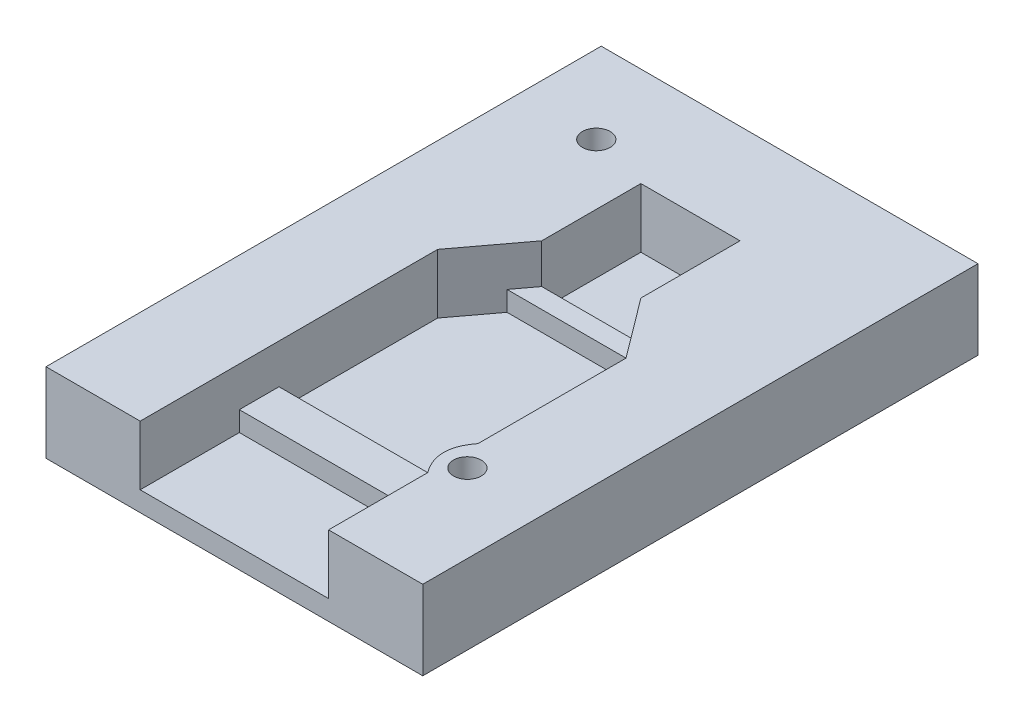
ISO-10303-21;
HEADER;
FILE_DESCRIPTION(('STEP AP214'),'2;1');
FILE_NAME('part.step','',(''),(''),'','','');
FILE_SCHEMA(('AUTOMOTIVE_DESIGN { 1 0 10303 214 1 1 1 1 }'));
ENDSEC;
DATA;
#1=APPLICATION_CONTEXT('core data for automotive mechanical design processes');
#2=APPLICATION_PROTOCOL_DEFINITION('international standard','automotive_design',2000,#1);
#3=PRODUCT_CONTEXT('',#1,'mechanical');
#4=PRODUCT('Part','Part','',(#3));
#5=PRODUCT_RELATED_PRODUCT_CATEGORY('part','',(#4));
#6=PRODUCT_DEFINITION_FORMATION('','',#4);
#7=PRODUCT_DEFINITION_CONTEXT('part definition',#1,'design');
#8=PRODUCT_DEFINITION('design','',#6,#7);
#9=PRODUCT_DEFINITION_SHAPE('','',#8);
#10=(LENGTH_UNIT() NAMED_UNIT(*) SI_UNIT(.MILLI.,.METRE.));
#11=(NAMED_UNIT(*) PLANE_ANGLE_UNIT() SI_UNIT($,.RADIAN.));
#12=(NAMED_UNIT(*) SI_UNIT($,.STERADIAN.) SOLID_ANGLE_UNIT());
#13=UNCERTAINTY_MEASURE_WITH_UNIT(LENGTH_MEASURE(1.E-05),#10,'distance_accuracy_value','');
#14=(GEOMETRIC_REPRESENTATION_CONTEXT(3) GLOBAL_UNCERTAINTY_ASSIGNED_CONTEXT((#13)) GLOBAL_UNIT_ASSIGNED_CONTEXT((#10,
#11,#12)) REPRESENTATION_CONTEXT('',''));
#15=CARTESIAN_POINT('',(0.,0.,0.));
#16=DIRECTION('',(0.,0.,1.));
#17=DIRECTION('',(1.,0.,0.));
#18=AXIS2_PLACEMENT_3D('',#15,#16,#17);
#19=CARTESIAN_POINT('',(0.,1.,0.));
#20=DIRECTION('',(0.,-1.,0.));
#21=DIRECTION('',(0.,0.,-1.));
#22=AXIS2_PLACEMENT_3D('',#19,#20,#21);
#23=PLANE('',#22);
#24=DIRECTION('',(-1.,0.,0.));
#25=VECTOR('',#24,1.);
#26=CARTESIAN_POINT('',(2.,1.,-2.));
#27=LINE('',#26,#25);
#28=CARTESIAN_POINT('',(11.1742122329964,1.,-2.00000000098245));
#29=VERTEX_POINT('',#28);
#30=CARTESIAN_POINT('',(2.,1.,-2.));
#31=VERTEX_POINT('',#30);
#32=EDGE_CURVE('E240',#29,#31,#27,.T.);
#33=ORIENTED_EDGE('',*,*,#32,.F.);
#34=CARTESIAN_POINT('',(11.5,1.,-2.53558572898459));
#35=CARTESIAN_POINT('',(10.5366275451212,1.,-1.30018745887848));
#36=CARTESIAN_POINT('',(11.5,1.,0.));
#37=B_SPLINE_CURVE_WITH_KNOTS('',2,(#34,#35,#36),.UNSPECIFIED.,.F.,.F.,(3,3),(0.,1.),.UNSPECIFIED.);
#38=CARTESIAN_POINT('',(11.5,1.,-2.53558572898459));
#39=VERTEX_POINT('',#38);
#40=EDGE_CURVE('E296',#39,#29,#37,.T.);
#41=ORIENTED_EDGE('',*,*,#40,.F.);
#42=DIRECTION('',(0.,0.,1.));
#43=VECTOR('',#42,1.);
#44=CARTESIAN_POINT('',(11.5,1.,-10.));
#45=LINE('',#44,#43);
#46=CARTESIAN_POINT('',(11.5,1.,-10.));
#47=VERTEX_POINT('',#46);
#48=EDGE_CURVE('E420',#47,#39,#45,.T.);
#49=ORIENTED_EDGE('',*,*,#48,.F.);
#50=DIRECTION('',(0.6,0.,0.8));
#51=VECTOR('',#50,1.);
#52=CARTESIAN_POINT('',(9.25000000000001,1.,-13.));
#53=LINE('',#52,#51);
#54=CARTESIAN_POINT('',(10.,1.,-12.));
#55=VERTEX_POINT('',#54);
#56=EDGE_CURVE('E456',#55,#47,#53,.T.);
#57=ORIENTED_EDGE('',*,*,#56,.F.);
#58=DIRECTION('',(1.,0.,0.));
#59=VECTOR('',#58,1.);
#60=CARTESIAN_POINT('',(10.,1.,-12.));
#61=LINE('',#60,#59);
#62=CARTESIAN_POINT('',(3.50000000000001,1.,-12.));
#63=VERTEX_POINT('',#62);
#64=EDGE_CURVE('E278',#63,#55,#61,.T.);
#65=ORIENTED_EDGE('',*,*,#64,.F.);
#66=DIRECTION('',(0.600000000000003,0.,-0.799999999999998));
#67=VECTOR('',#66,1.);
#68=CARTESIAN_POINT('',(4.25000000000001,1.,-13.));
#69=LINE('',#68,#67);
#70=CARTESIAN_POINT('',(2.,1.,-10.));
#71=VERTEX_POINT('',#70);
#72=EDGE_CURVE('E313',#71,#63,#69,.T.);
#73=ORIENTED_EDGE('',*,*,#72,.F.);
#74=DIRECTION('',(0.,0.,-1.));
#75=VECTOR('',#74,1.);
#76=CARTESIAN_POINT('',(2.,1.,-10.));
#77=LINE('',#76,#75);
#78=EDGE_CURVE('E292',#31,#71,#77,.T.);
#79=ORIENTED_EDGE('',*,*,#78,.F.);
#80=EDGE_LOOP('',(#33,#41,#49,#57,#65,#73,#79));
#81=FACE_BOUND('',#80,.T.);
#82=ADVANCED_FACE('F32',(#81),#23,.F.);
#83=CARTESIAN_POINT('',(2.,4.,-10.));
#84=DIRECTION('',(-1.,0.,0.));
#85=DIRECTION('',(0.,0.,1.));
#86=AXIS2_PLACEMENT_3D('',#83,#84,#85);
#87=PLANE('',#86);
#88=DIRECTION('',(0.,-1.,0.));
#89=VECTOR('',#88,1.);
#90=CARTESIAN_POINT('',(2.,2.,-2.));
#91=LINE('',#90,#89);
#92=CARTESIAN_POINT('',(2.,2.,-2.));
#93=VERTEX_POINT('',#92);
#94=EDGE_CURVE('E252',#93,#31,#91,.T.);
#95=ORIENTED_EDGE('',*,*,#94,.T.);
#96=ORIENTED_EDGE('',*,*,#78,.T.);
#97=DIRECTION('',(0.,-1.,0.));
#98=VECTOR('',#97,1.);
#99=CARTESIAN_POINT('',(2.,4.,-10.));
#100=LINE('',#99,#98);
#101=CARTESIAN_POINT('',(2.,4.,-10.));
#102=VERTEX_POINT('',#101);
#103=EDGE_CURVE('E384',#102,#71,#100,.T.);
#104=ORIENTED_EDGE('',*,*,#103,.F.);
#105=DIRECTION('',(0.,0.,-1.));
#106=VECTOR('',#105,1.);
#107=CARTESIAN_POINT('',(2.,4.,-2.));
#108=LINE('',#107,#106);
#109=CARTESIAN_POINT('',(2.,4.,5.));
#110=VERTEX_POINT('',#109);
#111=EDGE_CURVE('E293',#110,#102,#108,.T.);
#112=ORIENTED_EDGE('',*,*,#111,.F.);
#113=DIRECTION('',(0.,1.,0.));
#114=VECTOR('',#113,1.);
#115=CARTESIAN_POINT('',(2.,-32.8378486313773,5.));
#116=LINE('',#115,#114);
#117=CARTESIAN_POINT('',(2.,1.,5.));
#118=VERTEX_POINT('',#117);
#119=EDGE_CURVE('E182',#118,#110,#116,.T.);
#120=ORIENTED_EDGE('',*,*,#119,.F.);
#121=DIRECTION('',(0.,0.,1.));
#122=VECTOR('',#121,1.);
#123=CARTESIAN_POINT('',(2.,1.,0.));
#124=LINE('',#123,#122);
#125=CARTESIAN_POINT('',(2.,1.,0.));
#126=VERTEX_POINT('',#125);
#127=EDGE_CURVE('E49',#126,#118,#124,.T.);
#128=ORIENTED_EDGE('',*,*,#127,.F.);
#129=DIRECTION('',(0.,1.,0.));
#130=VECTOR('',#129,1.);
#131=CARTESIAN_POINT('',(2.,-32.8378486313773,0.));
#132=LINE('',#131,#130);
#133=CARTESIAN_POINT('',(2.,2.,0.));
#134=VERTEX_POINT('',#133);
#135=EDGE_CURVE('E214',#126,#134,#132,.T.);
#136=ORIENTED_EDGE('',*,*,#135,.T.);
#137=DIRECTION('',(0.,0.,1.));
#138=VECTOR('',#137,1.);
#139=CARTESIAN_POINT('',(2.,2.,0.));
#140=LINE('',#139,#138);
#141=EDGE_CURVE('E245',#93,#134,#140,.T.);
#142=ORIENTED_EDGE('',*,*,#141,.F.);
#143=EDGE_LOOP('',(#95,#96,#104,#112,#120,#128,#136,#142));
#144=FACE_BOUND('',#143,.T.);
#145=ADVANCED_FACE('F324',(#144),#87,.F.);
#146=CARTESIAN_POINT('',(11.5,4.,-2.53558572898459));
#147=CARTESIAN_POINT('',(10.5366275451212,4.,-1.30018745887848));
#148=CARTESIAN_POINT('',(11.5,4.,0.));
#149=B_SPLINE_CURVE_WITH_KNOTS('',2,(#146,#147,#148),.UNSPECIFIED.,.F.,.F.,(3,3),(0.,1.),.UNSPECIFIED.);
#150=DIRECTION('',(0.,-1.,0.));
#151=VECTOR('',#150,1.);
#152=SURFACE_OF_LINEAR_EXTRUSION('',#149,#151);
#153=DIRECTION('',(0.,-1.,0.));
#154=VECTOR('',#153,1.);
#155=CARTESIAN_POINT('',(11.1742122325654,4.,-2.));
#156=LINE('',#155,#154);
#157=CARTESIAN_POINT('',(11.1742122329961,2.,-2.));
#158=VERTEX_POINT('',#157);
#159=EDGE_CURVE('E11',#158,#29,#156,.T.);
#160=ORIENTED_EDGE('',*,*,#159,.F.);
#161=CARTESIAN_POINT('',(11.5,2.,-2.53558572898459));
#162=CARTESIAN_POINT('',(10.5366275451212,2.,-1.30018745887848));
#163=CARTESIAN_POINT('',(11.5,2.,0.));
#164=B_SPLINE_CURVE_WITH_KNOTS('',2,(#161,#162,#163),.UNSPECIFIED.,.F.,.F.,(3,3),(0.,1.),.UNSPECIFIED.);
#165=CARTESIAN_POINT('',(11.5,2.,0.));
#166=VERTEX_POINT('',#165);
#167=EDGE_CURVE('E41',#166,#158,#164,.F.);
#168=ORIENTED_EDGE('',*,*,#167,.F.);
#169=DIRECTION('',(0.,-1.,0.));
#170=VECTOR('',#169,1.);
#171=CARTESIAN_POINT('',(11.5,4.,0.));
#172=LINE('',#171,#170);
#173=CARTESIAN_POINT('',(11.5,4.,0.));
#174=VERTEX_POINT('',#173);
#175=EDGE_CURVE('E312',#174,#166,#172,.T.);
#176=ORIENTED_EDGE('',*,*,#175,.F.);
#177=CARTESIAN_POINT('',(11.5,4.,-2.53558572898459));
#178=VERTEX_POINT('',#177);
#179=EDGE_CURVE('E199',#178,#174,#149,.T.);
#180=ORIENTED_EDGE('',*,*,#179,.F.);
#181=DIRECTION('',(0.,-1.,0.));
#182=VECTOR('',#181,1.);
#183=CARTESIAN_POINT('',(11.5,4.,-2.53558572898459));
#184=LINE('',#183,#182);
#185=EDGE_CURVE('E418',#178,#39,#184,.T.);
#186=ORIENTED_EDGE('',*,*,#185,.T.);
#187=ORIENTED_EDGE('',*,*,#40,.T.);
#188=EDGE_LOOP('',(#160,#168,#176,#180,#186,#187));
#189=FACE_BOUND('',#188,.T.);
#190=ADVANCED_FACE('F319',(#189),#152,.F.);
#191=DIRECTION('',(-1.,0.,0.));
#192=VECTOR('',#191,1.);
#193=CARTESIAN_POINT('',(4.25000000000001,1.,-13.));
#194=LINE('',#193,#192);
#195=CARTESIAN_POINT('',(9.25000000000001,1.,-13.));
#196=VERTEX_POINT('',#195);
#197=CARTESIAN_POINT('',(4.25000000000001,1.,-13.));
#198=VERTEX_POINT('',#197);
#199=EDGE_CURVE('E268',#196,#198,#194,.T.);
#200=ORIENTED_EDGE('',*,*,#199,.F.);
#201=DIRECTION('',(0.,0.,1.));
#202=VECTOR('',#201,1.);
#203=CARTESIAN_POINT('',(9.25000000000001,1.,-18.));
#204=LINE('',#203,#202);
#205=CARTESIAN_POINT('',(9.25000000000001,1.,-18.));
#206=VERTEX_POINT('',#205);
#207=EDGE_CURVE('E458',#206,#196,#204,.T.);
#208=ORIENTED_EDGE('',*,*,#207,.F.);
#209=DIRECTION('',(1.,0.,0.));
#210=VECTOR('',#209,1.);
#211=CARTESIAN_POINT('',(4.25000000000001,1.,-18.));
#212=LINE('',#211,#210);
#213=CARTESIAN_POINT('',(4.25000000000001,1.,-18.));
#214=VERTEX_POINT('',#213);
#215=EDGE_CURVE('E404',#214,#206,#212,.T.);
#216=ORIENTED_EDGE('',*,*,#215,.F.);
#217=DIRECTION('',(0.,0.,-1.));
#218=VECTOR('',#217,1.);
#219=CARTESIAN_POINT('',(4.25000000000001,1.,-18.));
#220=LINE('',#219,#218);
#221=EDGE_CURVE('E460',#198,#214,#220,.T.);
#222=ORIENTED_EDGE('',*,*,#221,.F.);
#223=EDGE_LOOP('',(#200,#208,#216,#222));
#224=FACE_BOUND('',#223,.T.);
#225=ADVANCED_FACE('F323',(#224),#23,.F.);
#226=CARTESIAN_POINT('',(4.25000000000001,4.,-13.));
#227=DIRECTION('',(-0.799999999999998,0.,-0.600000000000003));
#228=DIRECTION('',(-0.600000000000003,0.,0.799999999999998));
#229=AXIS2_PLACEMENT_3D('',#226,#227,#228);
#230=PLANE('',#229);
#231=DIRECTION('',(0.,-1.,0.));
#232=VECTOR('',#231,1.);
#233=CARTESIAN_POINT('',(3.50000000000001,2.,-12.));
#234=LINE('',#233,#232);
#235=CARTESIAN_POINT('',(3.50000000000001,2.,-12.));
#236=VERTEX_POINT('',#235);
#237=EDGE_CURVE('E289',#236,#63,#234,.T.);
#238=ORIENTED_EDGE('',*,*,#237,.F.);
#239=DIRECTION('',(-0.600000000000003,0.,0.799999999999998));
#240=VECTOR('',#239,1.);
#241=CARTESIAN_POINT('',(3.50000000000001,2.,-12.));
#242=LINE('',#241,#240);
#243=CARTESIAN_POINT('',(4.25000000000001,2.,-13.));
#244=VERTEX_POINT('',#243);
#245=EDGE_CURVE('E264',#244,#236,#242,.T.);
#246=ORIENTED_EDGE('',*,*,#245,.F.);
#247=DIRECTION('',(0.,-1.,0.));
#248=VECTOR('',#247,1.);
#249=CARTESIAN_POINT('',(4.25000000000001,4.,-13.));
#250=LINE('',#249,#248);
#251=CARTESIAN_POINT('',(4.25000000000001,4.,-13.));
#252=VERTEX_POINT('',#251);
#253=EDGE_CURVE('E388',#252,#244,#250,.T.);
#254=ORIENTED_EDGE('',*,*,#253,.F.);
#255=DIRECTION('',(0.600000000000003,0.,-0.799999999999998));
#256=VECTOR('',#255,1.);
#257=CARTESIAN_POINT('',(4.25000000000001,4.,-13.));
#258=LINE('',#257,#256);
#259=EDGE_CURVE('E295',#102,#252,#258,.T.);
#260=ORIENTED_EDGE('',*,*,#259,.F.);
#261=ORIENTED_EDGE('',*,*,#103,.T.);
#262=ORIENTED_EDGE('',*,*,#72,.T.);
#263=EDGE_LOOP('',(#238,#246,#254,#260,#261,#262));
#264=FACE_BOUND('',#263,.T.);
#265=ADVANCED_FACE('F335',(#264),#230,.F.);
#266=CARTESIAN_POINT('',(9.25000000000001,4.,-13.));
#267=DIRECTION('',(0.8,0.,-0.6));
#268=DIRECTION('',(-0.6,0.,-0.8));
#269=AXIS2_PLACEMENT_3D('',#266,#267,#268);
#270=PLANE('',#269);
#271=DIRECTION('',(0.,-1.,0.));
#272=VECTOR('',#271,1.);
#273=CARTESIAN_POINT('',(10.,2.,-12.));
#274=LINE('',#273,#272);
#275=CARTESIAN_POINT('',(10.,2.,-12.));
#276=VERTEX_POINT('',#275);
#277=EDGE_CURVE('E287',#276,#55,#274,.T.);
#278=ORIENTED_EDGE('',*,*,#277,.T.);
#279=ORIENTED_EDGE('',*,*,#56,.T.);
#280=DIRECTION('',(0.,-1.,0.));
#281=VECTOR('',#280,1.);
#282=CARTESIAN_POINT('',(11.5,4.,-10.));
#283=LINE('',#282,#281);
#284=CARTESIAN_POINT('',(11.5,4.,-10.));
#285=VERTEX_POINT('',#284);
#286=EDGE_CURVE('E410',#285,#47,#283,.T.);
#287=ORIENTED_EDGE('',*,*,#286,.F.);
#288=DIRECTION('',(0.6,0.,0.8));
#289=VECTOR('',#288,1.);
#290=CARTESIAN_POINT('',(9.25000000000001,4.,-13.));
#291=LINE('',#290,#289);
#292=CARTESIAN_POINT('',(9.25000000000001,4.,-13.));
#293=VERTEX_POINT('',#292);
#294=EDGE_CURVE('E304',#293,#285,#291,.T.);
#295=ORIENTED_EDGE('',*,*,#294,.F.);
#296=DIRECTION('',(0.,-1.,0.));
#297=VECTOR('',#296,1.);
#298=CARTESIAN_POINT('',(9.25000000000001,4.,-13.));
#299=LINE('',#298,#297);
#300=CARTESIAN_POINT('',(9.25000000000001,2.,-13.));
#301=VERTEX_POINT('',#300);
#302=EDGE_CURVE('E406',#293,#301,#299,.T.);
#303=ORIENTED_EDGE('',*,*,#302,.T.);
#304=DIRECTION('',(-0.6,0.,-0.8));
#305=VECTOR('',#304,1.);
#306=CARTESIAN_POINT('',(9.25000000000001,2.,-13.));
#307=LINE('',#306,#305);
#308=EDGE_CURVE('E271',#276,#301,#307,.T.);
#309=ORIENTED_EDGE('',*,*,#308,.F.);
#310=EDGE_LOOP('',(#278,#279,#287,#295,#303,#309));
#311=FACE_BOUND('',#310,.T.);
#312=ADVANCED_FACE('F332',(#311),#270,.F.);
#313=CARTESIAN_POINT('',(0.,1.,0.));
#314=DIRECTION('',(0.,0.,-1.));
#315=DIRECTION('',(-1.,0.,0.));
#316=AXIS2_PLACEMENT_3D('',#313,#314,#315);
#317=PLANE('',#316);
#318=DIRECTION('',(1.,0.,0.));
#319=VECTOR('',#318,1.);
#320=CARTESIAN_POINT('',(2.,2.,0.));
#321=LINE('',#320,#319);
#322=EDGE_CURVE('E248',#134,#166,#321,.T.);
#323=ORIENTED_EDGE('',*,*,#322,.F.);
#324=ORIENTED_EDGE('',*,*,#135,.F.);
#325=DIRECTION('',(1.,0.,0.));
#326=VECTOR('',#325,1.);
#327=CARTESIAN_POINT('',(0.,1.,0.));
#328=LINE('',#327,#326);
#329=CARTESIAN_POINT('',(11.5,1.,0.));
#330=VERTEX_POINT('',#329);
#331=EDGE_CURVE('E222',#126,#330,#328,.T.);
#332=ORIENTED_EDGE('',*,*,#331,.T.);
#333=DIRECTION('',(0.,1.,0.));
#334=VECTOR('',#333,1.);
#335=CARTESIAN_POINT('',(11.5,-32.8378486313773,0.));
#336=LINE('',#335,#334);
#337=EDGE_CURVE('E183',#330,#166,#336,.T.);
#338=ORIENTED_EDGE('',*,*,#337,.T.);
#339=EDGE_LOOP('',(#323,#324,#332,#338));
#340=FACE_BOUND('',#339,.T.);
#341=ADVANCED_FACE('F34',(#340),#317,.F.);
#342=CARTESIAN_POINT('',(4.25000000000001,4.,-18.));
#343=DIRECTION('',(-1.,0.,0.));
#344=DIRECTION('',(0.,0.,1.));
#345=AXIS2_PLACEMENT_3D('',#342,#343,#344);
#346=PLANE('',#345);
#347=ORIENTED_EDGE('',*,*,#221,.T.);
#348=DIRECTION('',(0.,-1.,0.));
#349=VECTOR('',#348,1.);
#350=CARTESIAN_POINT('',(4.25000000000001,4.,-18.));
#351=LINE('',#350,#349);
#352=CARTESIAN_POINT('',(4.25000000000001,4.,-18.));
#353=VERTEX_POINT('',#352);
#354=EDGE_CURVE('E392',#353,#214,#351,.T.);
#355=ORIENTED_EDGE('',*,*,#354,.F.);
#356=DIRECTION('',(0.,0.,-1.));
#357=VECTOR('',#356,1.);
#358=CARTESIAN_POINT('',(4.25000000000001,4.,-18.));
#359=LINE('',#358,#357);
#360=EDGE_CURVE('E298',#252,#353,#359,.T.);
#361=ORIENTED_EDGE('',*,*,#360,.F.);
#362=ORIENTED_EDGE('',*,*,#253,.T.);
#363=DIRECTION('',(0.,-1.,0.));
#364=VECTOR('',#363,1.);
#365=CARTESIAN_POINT('',(4.25000000000001,2.,-13.));
#366=LINE('',#365,#364);
#367=EDGE_CURVE('E277',#244,#198,#366,.T.);
#368=ORIENTED_EDGE('',*,*,#367,.T.);
#369=EDGE_LOOP('',(#347,#355,#361,#362,#368));
#370=FACE_BOUND('',#369,.T.);
#371=ADVANCED_FACE('F343',(#370),#346,.F.);
#372=CARTESIAN_POINT('',(4.25000000000001,4.,-18.));
#373=DIRECTION('',(0.,0.,-1.));
#374=DIRECTION('',(-1.,0.,0.));
#375=AXIS2_PLACEMENT_3D('',#372,#373,#374);
#376=PLANE('',#375);
#377=ORIENTED_EDGE('',*,*,#215,.T.);
#378=DIRECTION('',(0.,-1.,0.));
#379=VECTOR('',#378,1.);
#380=CARTESIAN_POINT('',(9.25000000000001,4.,-18.));
#381=LINE('',#380,#379);
#382=CARTESIAN_POINT('',(9.25000000000001,4.,-18.));
#383=VERTEX_POINT('',#382);
#384=EDGE_CURVE('E403',#383,#206,#381,.T.);
#385=ORIENTED_EDGE('',*,*,#384,.F.);
#386=DIRECTION('',(1.,0.,0.));
#387=VECTOR('',#386,1.);
#388=CARTESIAN_POINT('',(4.25000000000001,4.,-18.));
#389=LINE('',#388,#387);
#390=EDGE_CURVE('E300',#353,#383,#389,.T.);
#391=ORIENTED_EDGE('',*,*,#390,.F.);
#392=ORIENTED_EDGE('',*,*,#354,.T.);
#393=EDGE_LOOP('',(#377,#385,#391,#392));
#394=FACE_BOUND('',#393,.T.);
#395=ADVANCED_FACE('F339',(#394),#376,.F.);
#396=CARTESIAN_POINT('',(9.25000000000001,4.,-18.));
#397=DIRECTION('',(1.,0.,0.));
#398=DIRECTION('',(0.,0.,-1.));
#399=AXIS2_PLACEMENT_3D('',#396,#397,#398);
#400=PLANE('',#399);
#401=ORIENTED_EDGE('',*,*,#207,.T.);
#402=DIRECTION('',(0.,-1.,0.));
#403=VECTOR('',#402,1.);
#404=CARTESIAN_POINT('',(9.25000000000001,2.,-13.));
#405=LINE('',#404,#403);
#406=EDGE_CURVE('E284',#301,#196,#405,.T.);
#407=ORIENTED_EDGE('',*,*,#406,.F.);
#408=ORIENTED_EDGE('',*,*,#302,.F.);
#409=DIRECTION('',(0.,0.,1.));
#410=VECTOR('',#409,1.);
#411=CARTESIAN_POINT('',(9.25000000000001,4.,-18.));
#412=LINE('',#411,#410);
#413=EDGE_CURVE('E302',#383,#293,#412,.T.);
#414=ORIENTED_EDGE('',*,*,#413,.F.);
#415=ORIENTED_EDGE('',*,*,#384,.T.);
#416=EDGE_LOOP('',(#401,#407,#408,#414,#415));
#417=FACE_BOUND('',#416,.T.);
#418=ADVANCED_FACE('F330',(#417),#400,.F.);
#419=CARTESIAN_POINT('',(11.5,4.,-10.));
#420=DIRECTION('',(1.,0.,0.));
#421=DIRECTION('',(0.,0.,-1.));
#422=AXIS2_PLACEMENT_3D('',#419,#420,#421);
#423=PLANE('',#422);
#424=ORIENTED_EDGE('',*,*,#48,.T.);
#425=ORIENTED_EDGE('',*,*,#185,.F.);
#426=DIRECTION('',(0.,0.,1.));
#427=VECTOR('',#426,1.);
#428=CARTESIAN_POINT('',(11.5,4.,-10.));
#429=LINE('',#428,#427);
#430=EDGE_CURVE('E306',#285,#178,#429,.T.);
#431=ORIENTED_EDGE('',*,*,#430,.F.);
#432=ORIENTED_EDGE('',*,*,#286,.T.);
#433=EDGE_LOOP('',(#424,#425,#431,#432));
#434=FACE_BOUND('',#433,.T.);
#435=ADVANCED_FACE('F327',(#434),#423,.F.);
#436=CARTESIAN_POINT('',(11.0183137725606,4.,-1.28399016168539));
#437=DIRECTION('',(0.,-1.,0.));
#438=DIRECTION('',(0.,0.,-1.));
#439=AXIS2_PLACEMENT_3D('',#436,#437,#438);
#440=PLANE('',#439);
#441=DIRECTION('',(1.,0.,0.));
#442=VECTOR('',#441,1.);
#443=CARTESIAN_POINT('',(-2.75,4.,5.));
#444=LINE('',#443,#442);
#445=CARTESIAN_POINT('',(-2.75,4.,5.));
#446=VERTEX_POINT('',#445);
#447=EDGE_CURVE('E212',#446,#110,#444,.T.);
#448=ORIENTED_EDGE('',*,*,#447,.T.);
#449=ORIENTED_EDGE('',*,*,#111,.T.);
#450=ORIENTED_EDGE('',*,*,#259,.T.);
#451=ORIENTED_EDGE('',*,*,#360,.T.);
#452=ORIENTED_EDGE('',*,*,#390,.T.);
#453=ORIENTED_EDGE('',*,*,#413,.T.);
#454=ORIENTED_EDGE('',*,*,#294,.T.);
#455=ORIENTED_EDGE('',*,*,#430,.T.);
#456=ORIENTED_EDGE('',*,*,#179,.T.);
#457=DIRECTION('',(0.,0.,1.));
#458=VECTOR('',#457,1.);
#459=CARTESIAN_POINT('',(11.5,4.,0.));
#460=LINE('',#459,#458);
#461=CARTESIAN_POINT('',(11.5,4.,5.));
#462=VERTEX_POINT('',#461);
#463=EDGE_CURVE('E179',#174,#462,#460,.T.);
#464=ORIENTED_EDGE('',*,*,#463,.T.);
#465=DIRECTION('',(1.,0.,0.));
#466=VECTOR('',#465,1.);
#467=CARTESIAN_POINT('',(11.5,4.,5.));
#468=LINE('',#467,#466);
#469=CARTESIAN_POINT('',(16.25,4.,5.));
#470=VERTEX_POINT('',#469);
#471=EDGE_CURVE('E186',#462,#470,#468,.T.);
#472=ORIENTED_EDGE('',*,*,#471,.T.);
#473=DIRECTION('',(0.,0.,-1.));
#474=VECTOR('',#473,1.);
#475=CARTESIAN_POINT('',(16.25,4.,-23.));
#476=LINE('',#475,#474);
#477=CARTESIAN_POINT('',(16.25,4.,-23.));
#478=VERTEX_POINT('',#477);
#479=EDGE_CURVE('E193',#470,#478,#476,.T.);
#480=ORIENTED_EDGE('',*,*,#479,.T.);
#481=DIRECTION('',(-1.,0.,0.));
#482=VECTOR('',#481,1.);
#483=CARTESIAN_POINT('',(-2.75,4.,-23.));
#484=LINE('',#483,#482);
#485=CARTESIAN_POINT('',(-2.75,4.,-23.));
#486=VERTEX_POINT('',#485);
#487=EDGE_CURVE('E206',#478,#486,#484,.T.);
#488=ORIENTED_EDGE('',*,*,#487,.T.);
#489=DIRECTION('',(0.,0.,1.));
#490=VECTOR('',#489,1.);
#491=CARTESIAN_POINT('',(-2.75,4.,-23.));
#492=LINE('',#491,#490);
#493=EDGE_CURVE('E209',#486,#446,#492,.T.);
#494=ORIENTED_EDGE('',*,*,#493,.T.);
#495=EDGE_LOOP('',(#448,#449,#450,#451,#452,#453,#454,#455,#456,#464,#472,#480,#488,#494));
#496=FACE_BOUND('',#495,.T.);
#497=CARTESIAN_POINT('',(12.3,4.,-1.2));
#498=DIRECTION('',(0.,-1.,0.));
#499=DIRECTION('',(0.,0.,-1.));
#500=AXIS2_PLACEMENT_3D('',#497,#498,#499);
#501=CIRCLE('',#500,0.7);
#502=CARTESIAN_POINT('',(12.3,4.,-1.9));
#503=VERTEX_POINT('',#502);
#504=EDGE_CURVE('E259',#503,#503,#501,.T.);
#505=ORIENTED_EDGE('',*,*,#504,.T.);
#506=EDGE_LOOP('',(#505));
#507=FACE_BOUND('',#506,.T.);
#508=CARTESIAN_POINT('',(1.2,4.,-18.8));
#509=DIRECTION('',(0.,-1.,0.));
#510=DIRECTION('',(0.,0.,-1.));
#511=AXIS2_PLACEMENT_3D('',#508,#509,#510);
#512=CIRCLE('',#511,0.699999999999999);
#513=CARTESIAN_POINT('',(1.2,4.,-19.5));
#514=VERTEX_POINT('',#513);
#515=EDGE_CURVE('E263',#514,#514,#512,.T.);
#516=ORIENTED_EDGE('',*,*,#515,.T.);
#517=EDGE_LOOP('',(#516));
#518=FACE_BOUND('',#517,.T.);
#519=ADVANCED_FACE('F196',(#496,#507,#518),#440,.F.);
#520=CARTESIAN_POINT('',(10.,2.,-12.));
#521=DIRECTION('',(0.,0.,-1.));
#522=DIRECTION('',(-1.,0.,0.));
#523=AXIS2_PLACEMENT_3D('',#520,#521,#522);
#524=PLANE('',#523);
#525=ORIENTED_EDGE('',*,*,#64,.T.);
#526=ORIENTED_EDGE('',*,*,#277,.F.);
#527=DIRECTION('',(1.,0.,0.));
#528=VECTOR('',#527,1.);
#529=CARTESIAN_POINT('',(10.,2.,-12.));
#530=LINE('',#529,#528);
#531=EDGE_CURVE('E267',#236,#276,#530,.T.);
#532=ORIENTED_EDGE('',*,*,#531,.F.);
#533=ORIENTED_EDGE('',*,*,#237,.T.);
#534=EDGE_LOOP('',(#525,#526,#532,#533));
#535=FACE_BOUND('',#534,.T.);
#536=ADVANCED_FACE('F464',(#535),#524,.F.);
#537=CARTESIAN_POINT('',(4.25000000000001,2.,-13.));
#538=DIRECTION('',(0.,0.,1.));
#539=DIRECTION('',(1.,0.,0.));
#540=AXIS2_PLACEMENT_3D('',#537,#538,#539);
#541=PLANE('',#540);
#542=ORIENTED_EDGE('',*,*,#199,.T.);
#543=ORIENTED_EDGE('',*,*,#367,.F.);
#544=DIRECTION('',(-1.,0.,0.));
#545=VECTOR('',#544,1.);
#546=CARTESIAN_POINT('',(4.25000000000001,2.,-13.));
#547=LINE('',#546,#545);
#548=EDGE_CURVE('E274',#301,#244,#547,.T.);
#549=ORIENTED_EDGE('',*,*,#548,.F.);
#550=ORIENTED_EDGE('',*,*,#406,.T.);
#551=EDGE_LOOP('',(#542,#543,#549,#550));
#552=FACE_BOUND('',#551,.T.);
#553=ADVANCED_FACE('F471',(#552),#541,.F.);
#554=CARTESIAN_POINT('',(0.,2.,0.));
#555=DIRECTION('',(0.,-1.,0.));
#556=DIRECTION('',(0.,0.,-1.));
#557=AXIS2_PLACEMENT_3D('',#554,#555,#556);
#558=PLANE('',#557);
#559=ORIENTED_EDGE('',*,*,#245,.T.);
#560=ORIENTED_EDGE('',*,*,#531,.T.);
#561=ORIENTED_EDGE('',*,*,#308,.T.);
#562=ORIENTED_EDGE('',*,*,#548,.T.);
#563=EDGE_LOOP('',(#559,#560,#561,#562));
#564=FACE_BOUND('',#563,.T.);
#565=ADVANCED_FACE('F467',(#564),#558,.F.);
#566=CARTESIAN_POINT('',(1.2,12.5,-18.8));
#567=DIRECTION('',(0.,-1.,0.));
#568=DIRECTION('',(0.,0.,-1.));
#569=AXIS2_PLACEMENT_3D('',#566,#567,#568);
#570=CYLINDRICAL_SURFACE('',#569,0.699999999999999);
#571=CARTESIAN_POINT('',(1.2,1.,-18.8));
#572=DIRECTION('',(0.,-1.,0.));
#573=DIRECTION('',(0.,0.,-1.));
#574=AXIS2_PLACEMENT_3D('',#571,#572,#573);
#575=CIRCLE('',#574,0.699999999999999);
#576=CARTESIAN_POINT('',(1.2,1.,-19.5));
#577=VERTEX_POINT('',#576);
#578=EDGE_CURVE('E260',#577,#577,#575,.T.);
#579=ORIENTED_EDGE('',*,*,#578,.T.);
#580=EDGE_LOOP('',(#579));
#581=FACE_BOUND('',#580,.T.);
#582=ORIENTED_EDGE('',*,*,#515,.F.);
#583=EDGE_LOOP('',(#582));
#584=FACE_BOUND('',#583,.T.);
#585=ADVANCED_FACE('F531',(#581,#584),#570,.F.);
#586=CARTESIAN_POINT('',(1.2,1.,-18.8));
#587=DIRECTION('',(0.,-1.,0.));
#588=DIRECTION('',(0.,0.,-1.));
#589=AXIS2_PLACEMENT_3D('',#586,#587,#588);
#590=PLANE('',#589);
#591=ORIENTED_EDGE('',*,*,#578,.F.);
#592=EDGE_LOOP('',(#591));
#593=FACE_BOUND('',#592,.T.);
#594=ADVANCED_FACE('F538',(#593),#590,.F.);
#595=CARTESIAN_POINT('',(12.3,12.5,-1.2));
#596=DIRECTION('',(0.,-1.,0.));
#597=DIRECTION('',(0.,0.,-1.));
#598=AXIS2_PLACEMENT_3D('',#595,#596,#597);
#599=CYLINDRICAL_SURFACE('',#598,0.7);
#600=CARTESIAN_POINT('',(12.3,1.,-1.2));
#601=DIRECTION('',(0.,-1.,0.));
#602=DIRECTION('',(0.,0.,-1.));
#603=AXIS2_PLACEMENT_3D('',#600,#601,#602);
#604=CIRCLE('',#603,0.7);
#605=CARTESIAN_POINT('',(12.3,1.,-1.9));
#606=VERTEX_POINT('',#605);
#607=EDGE_CURVE('E256',#606,#606,#604,.T.);
#608=ORIENTED_EDGE('',*,*,#607,.T.);
#609=EDGE_LOOP('',(#608));
#610=FACE_BOUND('',#609,.T.);
#611=ORIENTED_EDGE('',*,*,#504,.F.);
#612=EDGE_LOOP('',(#611));
#613=FACE_BOUND('',#612,.T.);
#614=ADVANCED_FACE('F546',(#610,#613),#599,.F.);
#615=CARTESIAN_POINT('',(12.3,1.,-1.2));
#616=DIRECTION('',(0.,-1.,0.));
#617=DIRECTION('',(0.,0.,-1.));
#618=AXIS2_PLACEMENT_3D('',#615,#616,#617);
#619=PLANE('',#618);
#620=ORIENTED_EDGE('',*,*,#607,.F.);
#621=EDGE_LOOP('',(#620));
#622=FACE_BOUND('',#621,.T.);
#623=ADVANCED_FACE('F554',(#622),#619,.F.);
#624=CARTESIAN_POINT('',(2.,2.,-2.));
#625=DIRECTION('',(0.,0.,1.));
#626=DIRECTION('',(1.,0.,0.));
#627=AXIS2_PLACEMENT_3D('',#624,#625,#626);
#628=PLANE('',#627);
#629=DIRECTION('',(-1.,0.,0.));
#630=VECTOR('',#629,1.);
#631=CARTESIAN_POINT('',(2.,2.,-2.));
#632=LINE('',#631,#630);
#633=EDGE_CURVE('E249',#158,#93,#632,.T.);
#634=ORIENTED_EDGE('',*,*,#633,.F.);
#635=ORIENTED_EDGE('',*,*,#159,.T.);
#636=ORIENTED_EDGE('',*,*,#32,.T.);
#637=ORIENTED_EDGE('',*,*,#94,.F.);
#638=EDGE_LOOP('',(#634,#635,#636,#637));
#639=FACE_BOUND('',#638,.T.);
#640=ADVANCED_FACE('F562',(#639),#628,.F.);
#641=CARTESIAN_POINT('',(0.,2.,0.));
#642=DIRECTION('',(0.,-1.,0.));
#643=DIRECTION('',(0.,0.,-1.));
#644=AXIS2_PLACEMENT_3D('',#641,#642,#643);
#645=PLANE('',#644);
#646=ORIENTED_EDGE('',*,*,#322,.T.);
#647=ORIENTED_EDGE('',*,*,#167,.T.);
#648=ORIENTED_EDGE('',*,*,#633,.T.);
#649=ORIENTED_EDGE('',*,*,#141,.T.);
#650=EDGE_LOOP('',(#646,#647,#648,#649));
#651=FACE_BOUND('',#650,.T.);
#652=ADVANCED_FACE('F571',(#651),#645,.F.);
#653=CARTESIAN_POINT('',(-2.75,0.,-23.));
#654=DIRECTION('',(-1.,0.,0.));
#655=DIRECTION('',(0.,0.,1.));
#656=AXIS2_PLACEMENT_3D('',#653,#654,#655);
#657=PLANE('',#656);
#658=DIRECTION('',(0.,1.,0.));
#659=VECTOR('',#658,1.);
#660=CARTESIAN_POINT('',(-2.75,0.,5.));
#661=LINE('',#660,#659);
#662=CARTESIAN_POINT('',(-2.75,0.,5.));
#663=VERTEX_POINT('',#662);
#664=EDGE_CURVE('E236',#663,#446,#661,.T.);
#665=ORIENTED_EDGE('',*,*,#664,.T.);
#666=ORIENTED_EDGE('',*,*,#493,.F.);
#667=DIRECTION('',(0.,1.,0.));
#668=VECTOR('',#667,1.);
#669=CARTESIAN_POINT('',(-2.75,0.,-23.));
#670=LINE('',#669,#668);
#671=CARTESIAN_POINT('',(-2.75,0.,-23.));
#672=VERTEX_POINT('',#671);
#673=EDGE_CURVE('E238',#672,#486,#670,.T.);
#674=ORIENTED_EDGE('',*,*,#673,.F.);
#675=DIRECTION('',(0.,0.,1.));
#676=VECTOR('',#675,1.);
#677=CARTESIAN_POINT('',(-2.75,0.,-23.));
#678=LINE('',#677,#676);
#679=EDGE_CURVE('E225',#672,#663,#678,.T.);
#680=ORIENTED_EDGE('',*,*,#679,.T.);
#681=EDGE_LOOP('',(#665,#666,#674,#680));
#682=FACE_BOUND('',#681,.T.);
#683=ADVANCED_FACE('F378',(#682),#657,.T.);
#684=CARTESIAN_POINT('',(-2.75,0.,-23.));
#685=DIRECTION('',(0.,0.,-1.));
#686=DIRECTION('',(-1.,0.,0.));
#687=AXIS2_PLACEMENT_3D('',#684,#685,#686);
#688=PLANE('',#687);
#689=ORIENTED_EDGE('',*,*,#673,.T.);
#690=ORIENTED_EDGE('',*,*,#487,.F.);
#691=DIRECTION('',(0.,1.,0.));
#692=VECTOR('',#691,1.);
#693=CARTESIAN_POINT('',(16.25,0.,-23.));
#694=LINE('',#693,#692);
#695=CARTESIAN_POINT('',(16.25,0.,-23.));
#696=VERTEX_POINT('',#695);
#697=EDGE_CURVE('E241',#696,#478,#694,.T.);
#698=ORIENTED_EDGE('',*,*,#697,.F.);
#699=DIRECTION('',(-1.,0.,0.));
#700=VECTOR('',#699,1.);
#701=CARTESIAN_POINT('',(-2.75,0.,-23.));
#702=LINE('',#701,#700);
#703=EDGE_CURVE('E233',#696,#672,#702,.T.);
#704=ORIENTED_EDGE('',*,*,#703,.T.);
#705=EDGE_LOOP('',(#689,#690,#698,#704));
#706=FACE_BOUND('',#705,.T.);
#707=ADVANCED_FACE('F372',(#706),#688,.T.);
#708=CARTESIAN_POINT('',(16.25,0.,-23.));
#709=DIRECTION('',(1.,0.,0.));
#710=DIRECTION('',(0.,0.,-1.));
#711=AXIS2_PLACEMENT_3D('',#708,#709,#710);
#712=PLANE('',#711);
#713=ORIENTED_EDGE('',*,*,#697,.T.);
#714=ORIENTED_EDGE('',*,*,#479,.F.);
#715=DIRECTION('',(0.,1.,0.));
#716=VECTOR('',#715,1.);
#717=CARTESIAN_POINT('',(16.25,0.,5.));
#718=LINE('',#717,#716);
#719=CARTESIAN_POINT('',(16.25,0.,5.));
#720=VERTEX_POINT('',#719);
#721=EDGE_CURVE('E189',#720,#470,#718,.T.);
#722=ORIENTED_EDGE('',*,*,#721,.F.);
#723=DIRECTION('',(0.,0.,-1.));
#724=VECTOR('',#723,1.);
#725=CARTESIAN_POINT('',(16.25,0.,-23.));
#726=LINE('',#725,#724);
#727=EDGE_CURVE('E230',#720,#696,#726,.T.);
#728=ORIENTED_EDGE('',*,*,#727,.T.);
#729=EDGE_LOOP('',(#713,#714,#722,#728));
#730=FACE_BOUND('',#729,.T.);
#731=ADVANCED_FACE('F376',(#730),#712,.T.);
#732=CARTESIAN_POINT('',(-2.75,0.,5.));
#733=DIRECTION('',(0.,0.,1.));
#734=DIRECTION('',(1.,0.,0.));
#735=AXIS2_PLACEMENT_3D('',#732,#733,#734);
#736=PLANE('',#735);
#737=DIRECTION('',(1.,0.,0.));
#738=VECTOR('',#737,1.);
#739=CARTESIAN_POINT('',(-2.75,1.,5.));
#740=LINE('',#739,#738);
#741=CARTESIAN_POINT('',(11.5,1.,5.));
#742=VERTEX_POINT('',#741);
#743=EDGE_CURVE('E224',#118,#742,#740,.T.);
#744=ORIENTED_EDGE('',*,*,#743,.F.);
#745=ORIENTED_EDGE('',*,*,#119,.T.);
#746=ORIENTED_EDGE('',*,*,#447,.F.);
#747=ORIENTED_EDGE('',*,*,#664,.F.);
#748=DIRECTION('',(1.,0.,0.));
#749=VECTOR('',#748,1.);
#750=CARTESIAN_POINT('',(-2.75,0.,5.));
#751=LINE('',#750,#749);
#752=EDGE_CURVE('E228',#663,#720,#751,.T.);
#753=ORIENTED_EDGE('',*,*,#752,.T.);
#754=ORIENTED_EDGE('',*,*,#721,.T.);
#755=ORIENTED_EDGE('',*,*,#471,.F.);
#756=DIRECTION('',(0.,1.,0.));
#757=VECTOR('',#756,1.);
#758=CARTESIAN_POINT('',(11.5,-32.8378486313773,5.));
#759=LINE('',#758,#757);
#760=EDGE_CURVE('E174',#742,#462,#759,.T.);
#761=ORIENTED_EDGE('',*,*,#760,.F.);
#762=EDGE_LOOP('',(#744,#745,#746,#747,#753,#754,#755,#761));
#763=FACE_BOUND('',#762,.T.);
#764=ADVANCED_FACE('F187',(#763),#736,.T.);
#765=CARTESIAN_POINT('',(0.,1.,0.));
#766=DIRECTION('',(0.,1.,0.));
#767=DIRECTION('',(0.,0.,1.));
#768=AXIS2_PLACEMENT_3D('',#765,#766,#767);
#769=PLANE('',#768);
#770=ORIENTED_EDGE('',*,*,#127,.T.);
#771=ORIENTED_EDGE('',*,*,#743,.T.);
#772=DIRECTION('',(0.,0.,-1.));
#773=VECTOR('',#772,1.);
#774=CARTESIAN_POINT('',(11.5,1.,0.));
#775=LINE('',#774,#773);
#776=EDGE_CURVE('E54',#742,#330,#775,.T.);
#777=ORIENTED_EDGE('',*,*,#776,.T.);
#778=ORIENTED_EDGE('',*,*,#331,.F.);
#779=EDGE_LOOP('',(#770,#771,#777,#778));
#780=FACE_BOUND('',#779,.T.);
#781=ADVANCED_FACE('F358',(#780),#769,.T.);
#782=CARTESIAN_POINT('',(0.,0.,0.));
#783=DIRECTION('',(0.,-1.,0.));
#784=DIRECTION('',(0.,0.,-1.));
#785=AXIS2_PLACEMENT_3D('',#782,#783,#784);
#786=PLANE('',#785);
#787=ORIENTED_EDGE('',*,*,#679,.F.);
#788=ORIENTED_EDGE('',*,*,#703,.F.);
#789=ORIENTED_EDGE('',*,*,#727,.F.);
#790=ORIENTED_EDGE('',*,*,#752,.F.);
#791=EDGE_LOOP('',(#787,#788,#789,#790));
#792=FACE_BOUND('',#791,.T.);
#793=ADVANCED_FACE('F356',(#792),#786,.T.);
#794=CARTESIAN_POINT('',(11.5,-32.8378486313773,0.));
#795=DIRECTION('',(-1.,0.,0.));
#796=DIRECTION('',(0.,0.,1.));
#797=AXIS2_PLACEMENT_3D('',#794,#795,#796);
#798=PLANE('',#797);
#799=ORIENTED_EDGE('',*,*,#776,.F.);
#800=ORIENTED_EDGE('',*,*,#760,.T.);
#801=ORIENTED_EDGE('',*,*,#463,.F.);
#802=ORIENTED_EDGE('',*,*,#175,.T.);
#803=ORIENTED_EDGE('',*,*,#337,.F.);
#804=EDGE_LOOP('',(#799,#800,#801,#802,#803));
#805=FACE_BOUND('',#804,.T.);
#806=ADVANCED_FACE('F176',(#805),#798,.T.);
#807=CLOSED_SHELL('',(#82,#145,#190,#225,#265,#312,#341,#371,#395,#418,#435,#519,#536,#553,#565,
#585,#594,#614,#623,#640,#652,#683,#707,#731,#764,#781,#793,#806));
#808=MANIFOLD_SOLID_BREP('B2',#807);
#809=ADVANCED_BREP_SHAPE_REPRESENTATION('',(#18,#808),#14);
#810=SHAPE_DEFINITION_REPRESENTATION(#9,#809);
ENDSEC;
END-ISO-10303-21;
